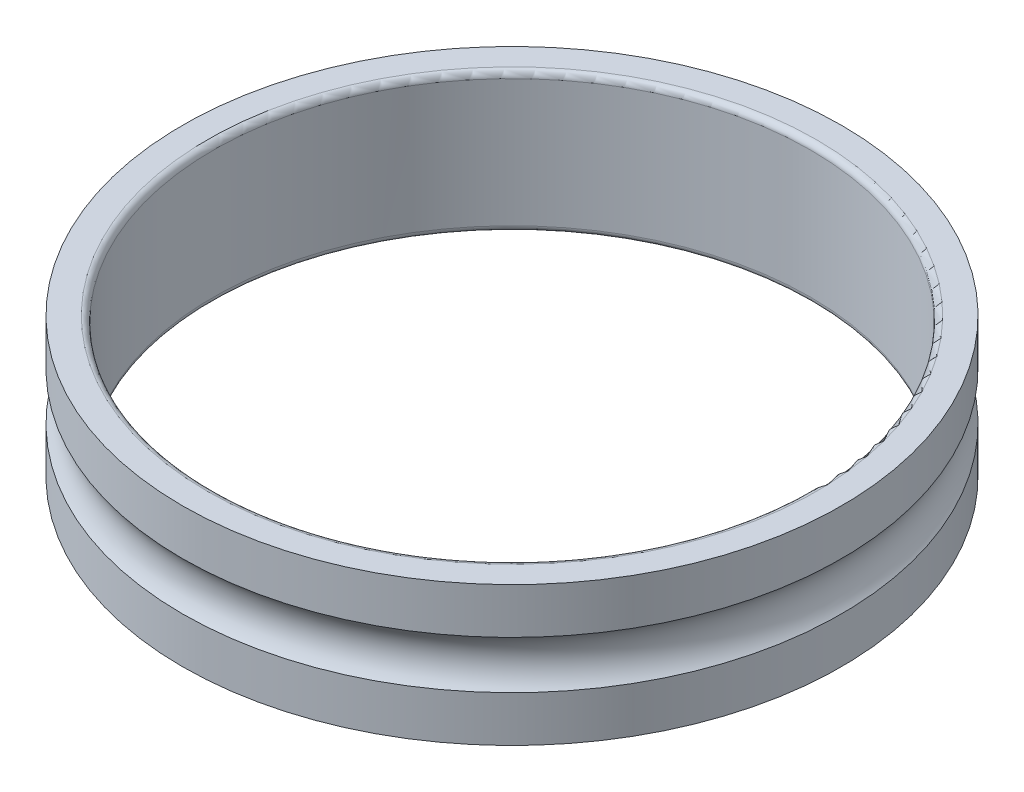
ISO-10303-21;
HEADER;
FILE_DESCRIPTION(('STEP AP214'),'2;1');
FILE_NAME('part.step','',(''),(''),'','','');
FILE_SCHEMA(('AUTOMOTIVE_DESIGN { 1 0 10303 214 1 1 1 1 }'));
ENDSEC;
DATA;
#1=APPLICATION_CONTEXT('core data for automotive mechanical design processes');
#2=APPLICATION_PROTOCOL_DEFINITION('international standard','automotive_design',2000,#1);
#3=PRODUCT_CONTEXT('',#1,'mechanical');
#4=PRODUCT('Part','Part','',(#3));
#5=PRODUCT_RELATED_PRODUCT_CATEGORY('part','',(#4));
#6=PRODUCT_DEFINITION_FORMATION('','',#4);
#7=PRODUCT_DEFINITION_CONTEXT('part definition',#1,'design');
#8=PRODUCT_DEFINITION('design','',#6,#7);
#9=PRODUCT_DEFINITION_SHAPE('','',#8);
#10=(LENGTH_UNIT() NAMED_UNIT(*) SI_UNIT(.MILLI.,.METRE.));
#11=(NAMED_UNIT(*) PLANE_ANGLE_UNIT() SI_UNIT($,.RADIAN.));
#12=(NAMED_UNIT(*) SI_UNIT($,.STERADIAN.) SOLID_ANGLE_UNIT());
#13=UNCERTAINTY_MEASURE_WITH_UNIT(LENGTH_MEASURE(1.E-05),#10,'distance_accuracy_value','');
#14=(GEOMETRIC_REPRESENTATION_CONTEXT(3) GLOBAL_UNCERTAINTY_ASSIGNED_CONTEXT((#13)) GLOBAL_UNIT_ASSIGNED_CONTEXT((#10,
#11,#12)) REPRESENTATION_CONTEXT('',''));
#15=CARTESIAN_POINT('',(0.,0.,0.));
#16=DIRECTION('',(0.,0.,1.));
#17=DIRECTION('',(1.,0.,0.));
#18=AXIS2_PLACEMENT_3D('',#15,#16,#17);
#19=CARTESIAN_POINT('',(0.,-3.5,0.));
#20=DIRECTION('',(0.,1.,0.));
#21=DIRECTION('',(1.,0.,0.));
#22=AXIS2_PLACEMENT_3D('',#19,#20,#21);
#23=PLANE('',#22);
#24=CARTESIAN_POINT('',(0.,-3.5,0.));
#25=DIRECTION('',(0.,1.,0.));
#26=DIRECTION('',(0.,0.,-1.));
#27=AXIS2_PLACEMENT_3D('',#24,#25,#26);
#28=CIRCLE('',#27,15.3);
#29=CARTESIAN_POINT('',(0.,-3.5,-15.3));
#30=VERTEX_POINT('',#29);
#31=EDGE_CURVE('E63',#30,#30,#28,.T.);
#32=ORIENTED_EDGE('',*,*,#31,.T.);
#33=EDGE_LOOP('',(#32));
#34=FACE_BOUND('',#33,.T.);
#35=CARTESIAN_POINT('',(0.,-3.5,0.));
#36=DIRECTION('',(0.,-1.,0.));
#37=DIRECTION('',(0.,0.,-1.));
#38=AXIS2_PLACEMENT_3D('',#35,#36,#37);
#39=CIRCLE('',#38,16.555);
#40=CARTESIAN_POINT('',(0.,-3.5,16.555));
#41=VERTEX_POINT('',#40);
#42=EDGE_CURVE('E11',#41,#41,#39,.T.);
#43=ORIENTED_EDGE('',*,*,#42,.T.);
#44=EDGE_LOOP('',(#43));
#45=FACE_BOUND('',#44,.T.);
#46=ADVANCED_FACE('F16',(#34,#45),#23,.F.);
#47=CARTESIAN_POINT('',(0.,-3.85,0.));
#48=DIRECTION('',(0.,1.,0.));
#49=DIRECTION('',(0.,0.,-1.));
#50=AXIS2_PLACEMENT_3D('',#47,#48,#49);
#51=CYLINDRICAL_SURFACE('',#50,16.555);
#52=CARTESIAN_POINT('',(0.,-1.201350802222,0.));
#53=DIRECTION('',(0.,-1.,0.));
#54=DIRECTION('',(0.,0.,-1.));
#55=AXIS2_PLACEMENT_3D('',#52,#53,#54);
#56=CIRCLE('',#55,16.555);
#57=CARTESIAN_POINT('',(0.,-1.201350802222,-16.555));
#58=VERTEX_POINT('',#57);
#59=EDGE_CURVE('E27',#58,#58,#56,.T.);
#60=ORIENTED_EDGE('',*,*,#59,.T.);
#61=EDGE_LOOP('',(#60));
#62=FACE_BOUND('',#61,.T.);
#63=ORIENTED_EDGE('',*,*,#42,.F.);
#64=EDGE_LOOP('',(#63));
#65=FACE_BOUND('',#64,.T.);
#66=ADVANCED_FACE('F98',(#62,#65),#51,.T.);
#67=CARTESIAN_POINT('',(0.,0.,0.));
#68=DIRECTION('',(0.,1.,0.));
#69=DIRECTION('',(0.,0.,-1.));
#70=AXIS2_PLACEMENT_3D('',#67,#68,#69);
#71=TOROIDAL_SURFACE('',#70,17.8275,1.75);
#72=ORIENTED_EDGE('',*,*,#59,.F.);
#73=EDGE_LOOP('',(#72));
#74=FACE_BOUND('',#73,.T.);
#75=CARTESIAN_POINT('',(0.,1.201350802222,0.));
#76=DIRECTION('',(0.,-1.,0.));
#77=DIRECTION('',(0.,0.,-1.));
#78=AXIS2_PLACEMENT_3D('',#75,#76,#77);
#79=CIRCLE('',#78,16.555);
#80=CARTESIAN_POINT('',(0.,1.201350802222,16.555));
#81=VERTEX_POINT('',#80);
#82=EDGE_CURVE('E77',#81,#81,#79,.T.);
#83=ORIENTED_EDGE('',*,*,#82,.T.);
#84=EDGE_LOOP('',(#83));
#85=FACE_BOUND('',#84,.T.);
#86=ADVANCED_FACE('F18',(#74,#85),#71,.F.);
#87=CARTESIAN_POINT('',(0.,-3.85,0.));
#88=DIRECTION('',(0.,1.,0.));
#89=DIRECTION('',(0.,0.,-1.));
#90=AXIS2_PLACEMENT_3D('',#87,#88,#89);
#91=CYLINDRICAL_SURFACE('',#90,16.555);
#92=CARTESIAN_POINT('',(0.,3.5,0.));
#93=DIRECTION('',(0.,1.,0.));
#94=DIRECTION('',(0.,0.,-1.));
#95=AXIS2_PLACEMENT_3D('',#92,#93,#94);
#96=CIRCLE('',#95,16.555);
#97=CARTESIAN_POINT('',(0.,3.5,16.555));
#98=VERTEX_POINT('',#97);
#99=EDGE_CURVE('E75',#98,#98,#96,.T.);
#100=ORIENTED_EDGE('',*,*,#99,.F.);
#101=EDGE_LOOP('',(#100));
#102=FACE_BOUND('',#101,.T.);
#103=ORIENTED_EDGE('',*,*,#82,.F.);
#104=EDGE_LOOP('',(#103));
#105=FACE_BOUND('',#104,.T.);
#106=ADVANCED_FACE('F85',(#102,#105),#91,.T.);
#107=CARTESIAN_POINT('',(0.,3.5,0.));
#108=DIRECTION('',(0.,1.,0.));
#109=DIRECTION('',(1.,0.,0.));
#110=AXIS2_PLACEMENT_3D('',#107,#108,#109);
#111=PLANE('',#110);
#112=CARTESIAN_POINT('',(0.,3.5,0.));
#113=DIRECTION('',(0.,-1.,0.));
#114=DIRECTION('',(0.,0.,-1.));
#115=AXIS2_PLACEMENT_3D('',#112,#113,#114);
#116=CIRCLE('',#115,15.3);
#117=CARTESIAN_POINT('',(0.,3.5,15.3));
#118=VERTEX_POINT('',#117);
#119=EDGE_CURVE('E20',#118,#118,#116,.T.);
#120=ORIENTED_EDGE('',*,*,#119,.T.);
#121=EDGE_LOOP('',(#120));
#122=FACE_BOUND('',#121,.T.);
#123=ORIENTED_EDGE('',*,*,#99,.T.);
#124=EDGE_LOOP('',(#123));
#125=FACE_BOUND('',#124,.T.);
#126=ADVANCED_FACE('F87',(#122,#125),#111,.T.);
#127=CARTESIAN_POINT('',(0.,3.2,0.));
#128=DIRECTION('',(0.,1.,0.));
#129=DIRECTION('',(0.,0.,-1.));
#130=AXIS2_PLACEMENT_3D('',#127,#128,#129);
#131=TOROIDAL_SURFACE('',#130,15.3,0.3);
#132=CARTESIAN_POINT('',(0.,3.2,0.));
#133=DIRECTION('',(0.,-1.,0.));
#134=DIRECTION('',(0.,0.,-1.));
#135=AXIS2_PLACEMENT_3D('',#132,#133,#134);
#136=CIRCLE('',#135,15.);
#137=CARTESIAN_POINT('',(0.,3.2,-15.));
#138=VERTEX_POINT('',#137);
#139=EDGE_CURVE('E66',#138,#138,#136,.T.);
#140=ORIENTED_EDGE('',*,*,#139,.T.);
#141=EDGE_LOOP('',(#140));
#142=FACE_BOUND('',#141,.T.);
#143=ORIENTED_EDGE('',*,*,#119,.F.);
#144=EDGE_LOOP('',(#143));
#145=FACE_BOUND('',#144,.T.);
#146=ADVANCED_FACE('F95',(#142,#145),#131,.T.);
#147=CARTESIAN_POINT('',(0.,-3.85,0.));
#148=DIRECTION('',(0.,1.,0.));
#149=DIRECTION('',(0.,0.,-1.));
#150=AXIS2_PLACEMENT_3D('',#147,#148,#149);
#151=CYLINDRICAL_SURFACE('',#150,15.);
#152=ORIENTED_EDGE('',*,*,#139,.F.);
#153=EDGE_LOOP('',(#152));
#154=FACE_BOUND('',#153,.T.);
#155=CARTESIAN_POINT('',(0.,-3.2,0.));
#156=DIRECTION('',(0.,-1.,0.));
#157=DIRECTION('',(0.,0.,-1.));
#158=AXIS2_PLACEMENT_3D('',#155,#156,#157);
#159=CIRCLE('',#158,15.);
#160=CARTESIAN_POINT('',(0.,-3.2,15.));
#161=VERTEX_POINT('',#160);
#162=EDGE_CURVE('E67',#161,#161,#159,.T.);
#163=ORIENTED_EDGE('',*,*,#162,.T.);
#164=EDGE_LOOP('',(#163));
#165=FACE_BOUND('',#164,.T.);
#166=ADVANCED_FACE('F110',(#154,#165),#151,.F.);
#167=CARTESIAN_POINT('',(0.,-3.2,0.));
#168=DIRECTION('',(0.,1.,0.));
#169=DIRECTION('',(0.,0.,-1.));
#170=AXIS2_PLACEMENT_3D('',#167,#168,#169);
#171=TOROIDAL_SURFACE('',#170,15.3,0.3);
#172=ORIENTED_EDGE('',*,*,#31,.F.);
#173=EDGE_LOOP('',(#172));
#174=FACE_BOUND('',#173,.T.);
#175=ORIENTED_EDGE('',*,*,#162,.F.);
#176=EDGE_LOOP('',(#175));
#177=FACE_BOUND('',#176,.T.);
#178=ADVANCED_FACE('F112',(#174,#177),#171,.T.);
#179=CLOSED_SHELL('',(#46,#66,#86,#106,#126,#146,#166,#178));
#180=MANIFOLD_SOLID_BREP('B1',#179);
#181=ADVANCED_BREP_SHAPE_REPRESENTATION('',(#18,#180),#14);
#182=SHAPE_DEFINITION_REPRESENTATION(#9,#181);
ENDSEC;
END-ISO-10303-21;
